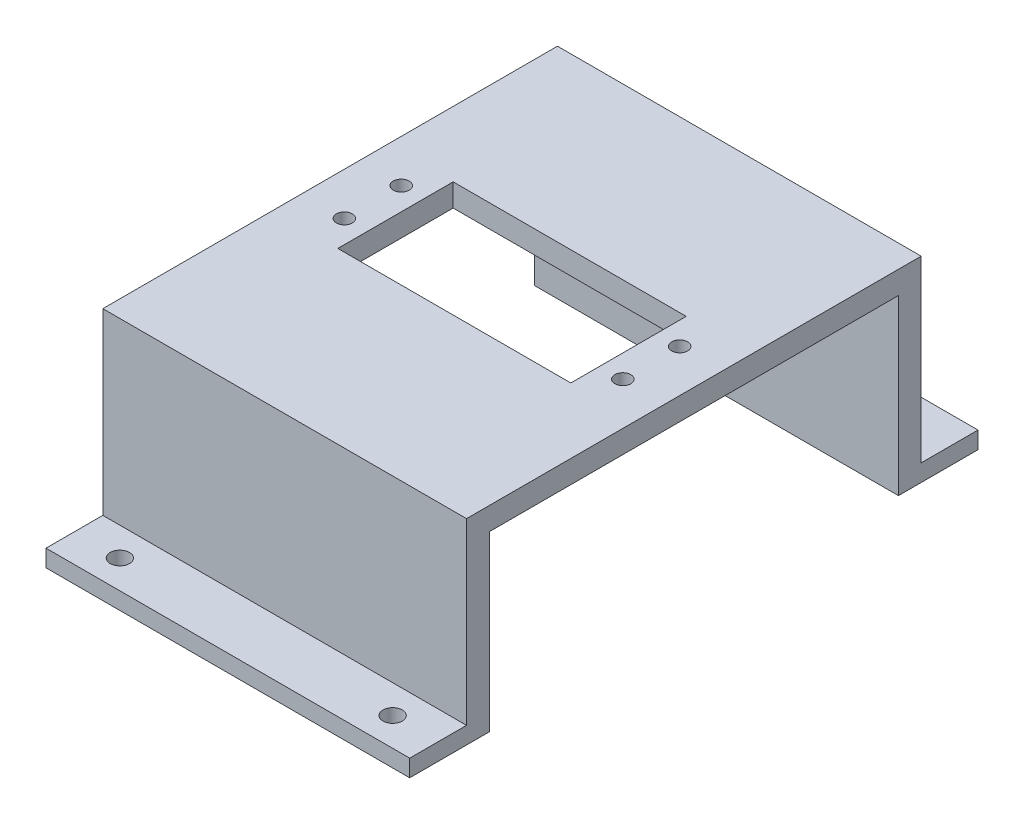
ISO-10303-21;
HEADER;
FILE_DESCRIPTION(('STEP AP214'),'2;1');
FILE_NAME('part.step','',(''),(''),'','','');
FILE_SCHEMA(('AUTOMOTIVE_DESIGN { 1 0 10303 214 1 1 1 1 }'));
ENDSEC;
DATA;
#1=APPLICATION_CONTEXT('core data for automotive mechanical design processes');
#2=APPLICATION_PROTOCOL_DEFINITION('international standard','automotive_design',2000,#1);
#3=PRODUCT_CONTEXT('',#1,'mechanical');
#4=PRODUCT('Part','Part','',(#3));
#5=PRODUCT_RELATED_PRODUCT_CATEGORY('part','',(#4));
#6=PRODUCT_DEFINITION_FORMATION('','',#4);
#7=PRODUCT_DEFINITION_CONTEXT('part definition',#1,'design');
#8=PRODUCT_DEFINITION('design','',#6,#7);
#9=PRODUCT_DEFINITION_SHAPE('','',#8);
#10=(LENGTH_UNIT() NAMED_UNIT(*) SI_UNIT(.MILLI.,.METRE.));
#11=(NAMED_UNIT(*) PLANE_ANGLE_UNIT() SI_UNIT($,.RADIAN.));
#12=(NAMED_UNIT(*) SI_UNIT($,.STERADIAN.) SOLID_ANGLE_UNIT());
#13=UNCERTAINTY_MEASURE_WITH_UNIT(LENGTH_MEASURE(1.E-05),#10,'distance_accuracy_value','');
#14=(GEOMETRIC_REPRESENTATION_CONTEXT(3) GLOBAL_UNCERTAINTY_ASSIGNED_CONTEXT((#13)) GLOBAL_UNIT_ASSIGNED_CONTEXT((#10,
#11,#12)) REPRESENTATION_CONTEXT('',''));
#15=CARTESIAN_POINT('',(0.,0.,0.));
#16=DIRECTION('',(0.,0.,1.));
#17=DIRECTION('',(1.,0.,0.));
#18=AXIS2_PLACEMENT_3D('',#15,#16,#17);
#19=CARTESIAN_POINT('',(88.8,5.,-130.));
#20=DIRECTION('',(0.,-1.,0.));
#21=DIRECTION('',(1.,0.,0.));
#22=AXIS2_PLACEMENT_3D('',#19,#20,#21);
#23=CYLINDRICAL_SURFACE('',#22,1.7);
#24=DIRECTION('',(0.,1.,0.));
#25=VECTOR('',#24,1.);
#26=CARTESIAN_POINT('',(90.5,5.,-130.));
#27=LINE('',#26,#25);
#28=CARTESIAN_POINT('',(90.5,5.,-130.));
#29=VERTEX_POINT('',#28);
#30=CARTESIAN_POINT('',(90.5,8.,-130.));
#31=VERTEX_POINT('',#30);
#32=EDGE_CURVE('E11',#29,#31,#27,.T.);
#33=ORIENTED_EDGE('',*,*,#32,.T.);
#34=CARTESIAN_POINT('',(88.8,8.,-130.));
#35=DIRECTION('',(0.,1.,0.));
#36=DIRECTION('',(1.,0.,0.));
#37=AXIS2_PLACEMENT_3D('',#34,#35,#36);
#38=CIRCLE('',#37,1.7);
#39=EDGE_CURVE('E277',#31,#31,#38,.T.);
#40=ORIENTED_EDGE('',*,*,#39,.T.);
#41=ORIENTED_EDGE('',*,*,#32,.F.);
#42=CARTESIAN_POINT('',(88.8,5.,-130.));
#43=DIRECTION('',(0.,1.,0.));
#44=DIRECTION('',(1.,0.,0.));
#45=AXIS2_PLACEMENT_3D('',#42,#43,#44);
#46=CIRCLE('',#45,1.7);
#47=EDGE_CURVE('E463',#29,#29,#46,.T.);
#48=ORIENTED_EDGE('',*,*,#47,.F.);
#49=EDGE_LOOP('',(#33,#40,#41,#48));
#50=FACE_BOUND('',#49,.T.);
#51=ADVANCED_FACE('F17',(#50),#23,.F.);
#52=CARTESIAN_POINT('',(40.8,5.,-130.));
#53=DIRECTION('',(0.,-1.,0.));
#54=DIRECTION('',(1.,0.,0.));
#55=AXIS2_PLACEMENT_3D('',#52,#53,#54);
#56=CYLINDRICAL_SURFACE('',#55,1.7);
#57=DIRECTION('',(0.,1.,0.));
#58=VECTOR('',#57,1.);
#59=CARTESIAN_POINT('',(42.5,5.,-130.));
#60=LINE('',#59,#58);
#61=CARTESIAN_POINT('',(42.5,5.,-130.));
#62=VERTEX_POINT('',#61);
#63=CARTESIAN_POINT('',(42.5,8.,-130.));
#64=VERTEX_POINT('',#63);
#65=EDGE_CURVE('E25',#62,#64,#60,.T.);
#66=ORIENTED_EDGE('',*,*,#65,.T.);
#67=CARTESIAN_POINT('',(40.8,8.,-130.));
#68=DIRECTION('',(0.,1.,0.));
#69=DIRECTION('',(1.,0.,0.));
#70=AXIS2_PLACEMENT_3D('',#67,#68,#69);
#71=CIRCLE('',#70,1.7);
#72=EDGE_CURVE('E388',#64,#64,#71,.T.);
#73=ORIENTED_EDGE('',*,*,#72,.T.);
#74=ORIENTED_EDGE('',*,*,#65,.F.);
#75=CARTESIAN_POINT('',(40.8,5.,-130.));
#76=DIRECTION('',(0.,1.,0.));
#77=DIRECTION('',(1.,0.,0.));
#78=AXIS2_PLACEMENT_3D('',#75,#76,#77);
#79=CIRCLE('',#78,1.7);
#80=EDGE_CURVE('E459',#62,#62,#79,.T.);
#81=ORIENTED_EDGE('',*,*,#80,.F.);
#82=EDGE_LOOP('',(#66,#73,#74,#81));
#83=FACE_BOUND('',#82,.T.);
#84=ADVANCED_FACE('F952',(#83),#56,.F.);
#85=CARTESIAN_POINT('',(89.3,35.5,-90.));
#86=DIRECTION('',(0.,-1.,0.));
#87=DIRECTION('',(1.,0.,0.));
#88=AXIS2_PLACEMENT_3D('',#85,#86,#87);
#89=CYLINDRICAL_SURFACE('',#88,1.4);
#90=DIRECTION('',(0.,1.,0.));
#91=VECTOR('',#90,1.);
#92=CARTESIAN_POINT('',(90.7,35.5,-90.));
#93=LINE('',#92,#91);
#94=CARTESIAN_POINT('',(90.7,35.5,-90.));
#95=VERTEX_POINT('',#94);
#96=CARTESIAN_POINT('',(90.7,39.5,-90.));
#97=VERTEX_POINT('',#96);
#98=EDGE_CURVE('E381',#95,#97,#93,.T.);
#99=ORIENTED_EDGE('',*,*,#98,.T.);
#100=CARTESIAN_POINT('',(89.3,39.5,-90.));
#101=DIRECTION('',(0.,1.,0.));
#102=DIRECTION('',(1.,0.,0.));
#103=AXIS2_PLACEMENT_3D('',#100,#101,#102);
#104=CIRCLE('',#103,1.4);
#105=EDGE_CURVE('E400',#97,#97,#104,.T.);
#106=ORIENTED_EDGE('',*,*,#105,.T.);
#107=ORIENTED_EDGE('',*,*,#98,.F.);
#108=CARTESIAN_POINT('',(89.3,35.5,-90.));
#109=DIRECTION('',(0.,1.,0.));
#110=DIRECTION('',(1.,0.,0.));
#111=AXIS2_PLACEMENT_3D('',#108,#109,#110);
#112=CIRCLE('',#111,1.4);
#113=EDGE_CURVE('E455',#95,#95,#112,.T.);
#114=ORIENTED_EDGE('',*,*,#113,.F.);
#115=EDGE_LOOP('',(#99,#106,#107,#114));
#116=FACE_BOUND('',#115,.T.);
#117=ADVANCED_FACE('F493',(#116),#89,.F.);
#118=CARTESIAN_POINT('',(85.3,35.5,-95.15));
#119=DIRECTION('',(0.,0.,1.));
#120=DIRECTION('',(0.,-1.,0.));
#121=AXIS2_PLACEMENT_3D('',#118,#119,#120);
#122=PLANE('',#121);
#123=DIRECTION('',(0.,1.,0.));
#124=VECTOR('',#123,1.);
#125=CARTESIAN_POINT('',(85.3,35.5,-95.15));
#126=LINE('',#125,#124);
#127=CARTESIAN_POINT('',(85.3,35.5,-95.15));
#128=VERTEX_POINT('',#127);
#129=CARTESIAN_POINT('',(85.3,39.5,-95.15));
#130=VERTEX_POINT('',#129);
#131=EDGE_CURVE('E309',#128,#130,#126,.T.);
#132=ORIENTED_EDGE('',*,*,#131,.T.);
#133=DIRECTION('',(-1.,0.,0.));
#134=VECTOR('',#133,1.);
#135=CARTESIAN_POINT('',(85.3,39.5,-95.15));
#136=LINE('',#135,#134);
#137=CARTESIAN_POINT('',(44.3,39.5,-95.15));
#138=VERTEX_POINT('',#137);
#139=EDGE_CURVE('E384',#130,#138,#136,.T.);
#140=ORIENTED_EDGE('',*,*,#139,.T.);
#141=DIRECTION('',(0.,1.,0.));
#142=VECTOR('',#141,1.);
#143=CARTESIAN_POINT('',(44.3,35.5,-95.15));
#144=LINE('',#143,#142);
#145=CARTESIAN_POINT('',(44.3,35.5,-95.15));
#146=VERTEX_POINT('',#145);
#147=EDGE_CURVE('E307',#146,#138,#144,.T.);
#148=ORIENTED_EDGE('',*,*,#147,.F.);
#149=DIRECTION('',(-1.,0.,0.));
#150=VECTOR('',#149,1.);
#151=CARTESIAN_POINT('',(85.3,35.5,-95.15));
#152=LINE('',#151,#150);
#153=EDGE_CURVE('E439',#128,#146,#152,.T.);
#154=ORIENTED_EDGE('',*,*,#153,.F.);
#155=EDGE_LOOP('',(#132,#140,#148,#154));
#156=FACE_BOUND('',#155,.T.);
#157=ADVANCED_FACE('F940',(#156),#122,.T.);
#158=CARTESIAN_POINT('',(85.3,35.5,-74.85));
#159=DIRECTION('',(-1.,0.,0.));
#160=DIRECTION('',(0.,0.,1.));
#161=AXIS2_PLACEMENT_3D('',#158,#159,#160);
#162=PLANE('',#161);
#163=DIRECTION('',(0.,1.,0.));
#164=VECTOR('',#163,1.);
#165=CARTESIAN_POINT('',(85.3,35.5,-74.85));
#166=LINE('',#165,#164);
#167=CARTESIAN_POINT('',(85.3,35.5,-74.85));
#168=VERTEX_POINT('',#167);
#169=CARTESIAN_POINT('',(85.3,39.5,-74.85));
#170=VERTEX_POINT('',#169);
#171=EDGE_CURVE('E313',#168,#170,#166,.T.);
#172=ORIENTED_EDGE('',*,*,#171,.T.);
#173=DIRECTION('',(0.,0.,-1.));
#174=VECTOR('',#173,1.);
#175=CARTESIAN_POINT('',(85.3,39.5,-74.85));
#176=LINE('',#175,#174);
#177=EDGE_CURVE('E386',#170,#130,#176,.T.);
#178=ORIENTED_EDGE('',*,*,#177,.T.);
#179=ORIENTED_EDGE('',*,*,#131,.F.);
#180=DIRECTION('',(0.,0.,-1.));
#181=VECTOR('',#180,1.);
#182=CARTESIAN_POINT('',(85.3,35.5,-74.85));
#183=LINE('',#182,#181);
#184=EDGE_CURVE('E436',#168,#128,#183,.T.);
#185=ORIENTED_EDGE('',*,*,#184,.F.);
#186=EDGE_LOOP('',(#172,#178,#179,#185));
#187=FACE_BOUND('',#186,.T.);
#188=ADVANCED_FACE('F928',(#187),#162,.T.);
#189=CARTESIAN_POINT('',(44.3,35.5,-95.15));
#190=DIRECTION('',(1.,0.,0.));
#191=DIRECTION('',(0.,1.,0.));
#192=AXIS2_PLACEMENT_3D('',#189,#190,#191);
#193=PLANE('',#192);
#194=ORIENTED_EDGE('',*,*,#147,.T.);
#195=DIRECTION('',(0.,0.,1.));
#196=VECTOR('',#195,1.);
#197=CARTESIAN_POINT('',(44.3,39.5,-95.15));
#198=LINE('',#197,#196);
#199=CARTESIAN_POINT('',(44.3,39.5,-74.85));
#200=VERTEX_POINT('',#199);
#201=EDGE_CURVE('E378',#138,#200,#198,.T.);
#202=ORIENTED_EDGE('',*,*,#201,.T.);
#203=DIRECTION('',(0.,1.,0.));
#204=VECTOR('',#203,1.);
#205=CARTESIAN_POINT('',(44.3,35.5,-74.85));
#206=LINE('',#205,#204);
#207=CARTESIAN_POINT('',(44.3,35.5,-74.85));
#208=VERTEX_POINT('',#207);
#209=EDGE_CURVE('E483',#208,#200,#206,.T.);
#210=ORIENTED_EDGE('',*,*,#209,.F.);
#211=DIRECTION('',(0.,0.,1.));
#212=VECTOR('',#211,1.);
#213=CARTESIAN_POINT('',(44.3,35.5,-95.15));
#214=LINE('',#213,#212);
#215=EDGE_CURVE('E441',#146,#208,#214,.T.);
#216=ORIENTED_EDGE('',*,*,#215,.F.);
#217=EDGE_LOOP('',(#194,#202,#210,#216));
#218=FACE_BOUND('',#217,.T.);
#219=ADVANCED_FACE('F919',(#218),#193,.T.);
#220=CARTESIAN_POINT('',(44.3,35.5,-74.85));
#221=DIRECTION('',(0.,0.,-1.));
#222=DIRECTION('',(-1.,0.,0.));
#223=AXIS2_PLACEMENT_3D('',#220,#221,#222);
#224=PLANE('',#223);
#225=ORIENTED_EDGE('',*,*,#209,.T.);
#226=DIRECTION('',(1.,0.,0.));
#227=VECTOR('',#226,1.);
#228=CARTESIAN_POINT('',(44.3,39.5,-74.85));
#229=LINE('',#228,#227);
#230=EDGE_CURVE('E372',#200,#170,#229,.T.);
#231=ORIENTED_EDGE('',*,*,#230,.T.);
#232=ORIENTED_EDGE('',*,*,#171,.F.);
#233=DIRECTION('',(1.,0.,0.));
#234=VECTOR('',#233,1.);
#235=CARTESIAN_POINT('',(44.3,35.5,-74.85));
#236=LINE('',#235,#234);
#237=EDGE_CURVE('E449',#208,#168,#236,.T.);
#238=ORIENTED_EDGE('',*,*,#237,.F.);
#239=EDGE_LOOP('',(#225,#231,#232,#238));
#240=FACE_BOUND('',#239,.T.);
#241=ADVANCED_FACE('F909',(#240),#224,.T.);
#242=CARTESIAN_POINT('',(40.3,35.5,-90.));
#243=DIRECTION('',(0.,-1.,0.));
#244=DIRECTION('',(1.,0.,0.));
#245=AXIS2_PLACEMENT_3D('',#242,#243,#244);
#246=CYLINDRICAL_SURFACE('',#245,1.4);
#247=DIRECTION('',(0.,1.,0.));
#248=VECTOR('',#247,1.);
#249=CARTESIAN_POINT('',(41.7,35.5,-90.));
#250=LINE('',#249,#248);
#251=CARTESIAN_POINT('',(41.7,35.5,-90.));
#252=VERTEX_POINT('',#251);
#253=CARTESIAN_POINT('',(41.7,39.5,-90.));
#254=VERTEX_POINT('',#253);
#255=EDGE_CURVE('E477',#252,#254,#250,.T.);
#256=ORIENTED_EDGE('',*,*,#255,.T.);
#257=CARTESIAN_POINT('',(40.3,39.5,-90.));
#258=DIRECTION('',(0.,1.,0.));
#259=DIRECTION('',(1.,0.,0.));
#260=AXIS2_PLACEMENT_3D('',#257,#258,#259);
#261=CIRCLE('',#260,1.4);
#262=EDGE_CURVE('E367',#254,#254,#261,.T.);
#263=ORIENTED_EDGE('',*,*,#262,.T.);
#264=ORIENTED_EDGE('',*,*,#255,.F.);
#265=CARTESIAN_POINT('',(40.3,35.5,-90.));
#266=DIRECTION('',(0.,1.,0.));
#267=DIRECTION('',(1.,0.,0.));
#268=AXIS2_PLACEMENT_3D('',#265,#266,#267);
#269=CIRCLE('',#268,1.4);
#270=EDGE_CURVE('E435',#252,#252,#269,.T.);
#271=ORIENTED_EDGE('',*,*,#270,.F.);
#272=EDGE_LOOP('',(#256,#263,#264,#271));
#273=FACE_BOUND('',#272,.T.);
#274=ADVANCED_FACE('F901',(#273),#246,.F.);
#275=CARTESIAN_POINT('',(89.3,35.5,-80.));
#276=DIRECTION('',(0.,-1.,0.));
#277=DIRECTION('',(1.,0.,0.));
#278=AXIS2_PLACEMENT_3D('',#275,#276,#277);
#279=CYLINDRICAL_SURFACE('',#278,1.4);
#280=DIRECTION('',(0.,1.,0.));
#281=VECTOR('',#280,1.);
#282=CARTESIAN_POINT('',(90.7,35.5,-80.));
#283=LINE('',#282,#281);
#284=CARTESIAN_POINT('',(90.7,35.5,-80.));
#285=VERTEX_POINT('',#284);
#286=CARTESIAN_POINT('',(90.7,39.5,-80.));
#287=VERTEX_POINT('',#286);
#288=EDGE_CURVE('E480',#285,#287,#283,.T.);
#289=ORIENTED_EDGE('',*,*,#288,.T.);
#290=CARTESIAN_POINT('',(89.3,39.5,-80.));
#291=DIRECTION('',(0.,1.,0.));
#292=DIRECTION('',(1.,0.,0.));
#293=AXIS2_PLACEMENT_3D('',#290,#291,#292);
#294=CIRCLE('',#293,1.4);
#295=EDGE_CURVE('E368',#287,#287,#294,.T.);
#296=ORIENTED_EDGE('',*,*,#295,.T.);
#297=ORIENTED_EDGE('',*,*,#288,.F.);
#298=CARTESIAN_POINT('',(89.3,35.5,-80.));
#299=DIRECTION('',(0.,1.,0.));
#300=DIRECTION('',(1.,0.,0.));
#301=AXIS2_PLACEMENT_3D('',#298,#299,#300);
#302=CIRCLE('',#301,1.4);
#303=EDGE_CURVE('E428',#285,#285,#302,.T.);
#304=ORIENTED_EDGE('',*,*,#303,.F.);
#305=EDGE_LOOP('',(#289,#296,#297,#304));
#306=FACE_BOUND('',#305,.T.);
#307=ADVANCED_FACE('F895',(#306),#279,.F.);
#308=CARTESIAN_POINT('',(40.3,35.5,-80.));
#309=DIRECTION('',(0.,-1.,0.));
#310=DIRECTION('',(1.,0.,0.));
#311=AXIS2_PLACEMENT_3D('',#308,#309,#310);
#312=CYLINDRICAL_SURFACE('',#311,1.4);
#313=DIRECTION('',(0.,1.,0.));
#314=VECTOR('',#313,1.);
#315=CARTESIAN_POINT('',(41.7,35.5,-80.));
#316=LINE('',#315,#314);
#317=CARTESIAN_POINT('',(41.7,35.5,-80.));
#318=VERTEX_POINT('',#317);
#319=CARTESIAN_POINT('',(41.7,39.5,-80.));
#320=VERTEX_POINT('',#319);
#321=EDGE_CURVE('E475',#318,#320,#316,.T.);
#322=ORIENTED_EDGE('',*,*,#321,.T.);
#323=CARTESIAN_POINT('',(40.3,39.5,-80.));
#324=DIRECTION('',(0.,1.,0.));
#325=DIRECTION('',(1.,0.,0.));
#326=AXIS2_PLACEMENT_3D('',#323,#324,#325);
#327=CIRCLE('',#326,1.4);
#328=EDGE_CURVE('E362',#320,#320,#327,.T.);
#329=ORIENTED_EDGE('',*,*,#328,.T.);
#330=ORIENTED_EDGE('',*,*,#321,.F.);
#331=CARTESIAN_POINT('',(40.3,35.5,-80.));
#332=DIRECTION('',(0.,1.,0.));
#333=DIRECTION('',(1.,0.,0.));
#334=AXIS2_PLACEMENT_3D('',#331,#332,#333);
#335=CIRCLE('',#334,1.4);
#336=EDGE_CURVE('E424',#318,#318,#335,.T.);
#337=ORIENTED_EDGE('',*,*,#336,.F.);
#338=EDGE_LOOP('',(#322,#329,#330,#337));
#339=FACE_BOUND('',#338,.T.);
#340=ADVANCED_FACE('F884',(#339),#312,.F.);
#341=CARTESIAN_POINT('',(88.8,5.,-40.));
#342=DIRECTION('',(0.,-1.,0.));
#343=DIRECTION('',(1.,0.,0.));
#344=AXIS2_PLACEMENT_3D('',#341,#342,#343);
#345=CYLINDRICAL_SURFACE('',#344,1.7);
#346=DIRECTION('',(0.,1.,0.));
#347=VECTOR('',#346,1.);
#348=CARTESIAN_POINT('',(90.5,5.,-40.));
#349=LINE('',#348,#347);
#350=CARTESIAN_POINT('',(90.5,5.,-40.));
#351=VERTEX_POINT('',#350);
#352=CARTESIAN_POINT('',(90.5,8.,-40.));
#353=VERTEX_POINT('',#352);
#354=EDGE_CURVE('E274',#351,#353,#349,.T.);
#355=ORIENTED_EDGE('',*,*,#354,.T.);
#356=CARTESIAN_POINT('',(88.8,8.,-40.));
#357=DIRECTION('',(0.,1.,0.));
#358=DIRECTION('',(1.,0.,0.));
#359=AXIS2_PLACEMENT_3D('',#356,#357,#358);
#360=CIRCLE('',#359,1.7);
#361=EDGE_CURVE('E318',#353,#353,#360,.T.);
#362=ORIENTED_EDGE('',*,*,#361,.T.);
#363=ORIENTED_EDGE('',*,*,#354,.F.);
#364=CARTESIAN_POINT('',(88.8,5.,-40.));
#365=DIRECTION('',(0.,1.,0.));
#366=DIRECTION('',(1.,0.,0.));
#367=AXIS2_PLACEMENT_3D('',#364,#365,#366);
#368=CIRCLE('',#367,1.7);
#369=EDGE_CURVE('E412',#351,#351,#368,.T.);
#370=ORIENTED_EDGE('',*,*,#369,.F.);
#371=EDGE_LOOP('',(#355,#362,#363,#370));
#372=FACE_BOUND('',#371,.T.);
#373=ADVANCED_FACE('F872',(#372),#345,.F.);
#374=CARTESIAN_POINT('',(40.8,5.,-40.));
#375=DIRECTION('',(0.,-1.,0.));
#376=DIRECTION('',(1.,0.,0.));
#377=AXIS2_PLACEMENT_3D('',#374,#375,#376);
#378=CYLINDRICAL_SURFACE('',#377,1.7);
#379=DIRECTION('',(0.,1.,0.));
#380=VECTOR('',#379,1.);
#381=CARTESIAN_POINT('',(42.5,5.,-40.));
#382=LINE('',#381,#380);
#383=CARTESIAN_POINT('',(42.5,5.,-40.));
#384=VERTEX_POINT('',#383);
#385=CARTESIAN_POINT('',(42.5,8.,-40.));
#386=VERTEX_POINT('',#385);
#387=EDGE_CURVE('E275',#384,#386,#382,.T.);
#388=ORIENTED_EDGE('',*,*,#387,.T.);
#389=CARTESIAN_POINT('',(40.8,8.,-40.));
#390=DIRECTION('',(0.,1.,0.));
#391=DIRECTION('',(1.,0.,0.));
#392=AXIS2_PLACEMENT_3D('',#389,#390,#391);
#393=CIRCLE('',#392,1.7);
#394=EDGE_CURVE('E314',#386,#386,#393,.T.);
#395=ORIENTED_EDGE('',*,*,#394,.T.);
#396=ORIENTED_EDGE('',*,*,#387,.F.);
#397=CARTESIAN_POINT('',(40.8,5.,-40.));
#398=DIRECTION('',(0.,1.,0.));
#399=DIRECTION('',(1.,0.,0.));
#400=AXIS2_PLACEMENT_3D('',#397,#398,#399);
#401=CIRCLE('',#400,1.7);
#402=EDGE_CURVE('E409',#384,#384,#401,.T.);
#403=ORIENTED_EDGE('',*,*,#402,.F.);
#404=EDGE_LOOP('',(#388,#395,#396,#403));
#405=FACE_BOUND('',#404,.T.);
#406=ADVANCED_FACE('F862',(#405),#378,.F.);
#407=CARTESIAN_POINT('',(64.8,8.,-130.));
#408=DIRECTION('',(0.,1.,0.));
#409=DIRECTION('',(0.,0.,-1.));
#410=AXIS2_PLACEMENT_3D('',#407,#408,#409);
#411=PLANE('',#410);
#412=ORIENTED_EDGE('',*,*,#39,.F.);
#413=EDGE_LOOP('',(#412));
#414=FACE_BOUND('',#413,.T.);
#415=ORIENTED_EDGE('',*,*,#72,.F.);
#416=EDGE_LOOP('',(#415));
#417=FACE_BOUND('',#416,.T.);
#418=DIRECTION('',(1.,0.,0.));
#419=VECTOR('',#418,1.);
#420=CARTESIAN_POINT('',(32.8,8.,-125.));
#421=LINE('',#420,#419);
#422=CARTESIAN_POINT('',(32.8,8.,-125.));
#423=VERTEX_POINT('',#422);
#424=CARTESIAN_POINT('',(96.8,8.,-125.));
#425=VERTEX_POINT('',#424);
#426=EDGE_CURVE('E405',#423,#425,#421,.T.);
#427=ORIENTED_EDGE('',*,*,#426,.T.);
#428=DIRECTION('',(0.,0.,-1.));
#429=VECTOR('',#428,1.);
#430=CARTESIAN_POINT('',(96.8,8.,-125.));
#431=LINE('',#430,#429);
#432=CARTESIAN_POINT('',(96.8,8.,-135.));
#433=VERTEX_POINT('',#432);
#434=EDGE_CURVE('E347',#425,#433,#431,.T.);
#435=ORIENTED_EDGE('',*,*,#434,.T.);
#436=DIRECTION('',(-1.,0.,0.));
#437=VECTOR('',#436,1.);
#438=CARTESIAN_POINT('',(96.8,8.,-135.));
#439=LINE('',#438,#437);
#440=CARTESIAN_POINT('',(32.8,8.,-135.));
#441=VERTEX_POINT('',#440);
#442=EDGE_CURVE('E394',#433,#441,#439,.T.);
#443=ORIENTED_EDGE('',*,*,#442,.T.);
#444=DIRECTION('',(0.,0.,1.));
#445=VECTOR('',#444,1.);
#446=CARTESIAN_POINT('',(32.8,8.,-135.));
#447=LINE('',#446,#445);
#448=EDGE_CURVE('E255',#441,#423,#447,.T.);
#449=ORIENTED_EDGE('',*,*,#448,.T.);
#450=EDGE_LOOP('',(#427,#435,#443,#449));
#451=FACE_BOUND('',#450,.T.);
#452=ADVANCED_FACE('F538',(#414,#417,#451),#411,.T.);
#453=CARTESIAN_POINT('',(96.8,5.,-135.));
#454=DIRECTION('',(0.,0.,1.));
#455=DIRECTION('',(0.,-1.,0.));
#456=AXIS2_PLACEMENT_3D('',#453,#454,#455);
#457=PLANE('',#456);
#458=DIRECTION('',(-1.,0.,0.));
#459=VECTOR('',#458,1.);
#460=CARTESIAN_POINT('',(96.8,5.,-135.));
#461=LINE('',#460,#459);
#462=CARTESIAN_POINT('',(96.8,5.,-135.));
#463=VERTEX_POINT('',#462);
#464=CARTESIAN_POINT('',(32.8,5.,-135.));
#465=VERTEX_POINT('',#464);
#466=EDGE_CURVE('E457',#463,#465,#461,.T.);
#467=ORIENTED_EDGE('',*,*,#466,.T.);
#468=DIRECTION('',(0.,1.,0.));
#469=VECTOR('',#468,1.);
#470=CARTESIAN_POINT('',(32.8,5.,-135.));
#471=LINE('',#470,#469);
#472=EDGE_CURVE('E280',#465,#441,#471,.T.);
#473=ORIENTED_EDGE('',*,*,#472,.T.);
#474=ORIENTED_EDGE('',*,*,#442,.F.);
#475=DIRECTION('',(0.,1.,0.));
#476=VECTOR('',#475,1.);
#477=CARTESIAN_POINT('',(96.8,5.,-135.));
#478=LINE('',#477,#476);
#479=EDGE_CURVE('E343',#463,#433,#478,.T.);
#480=ORIENTED_EDGE('',*,*,#479,.F.);
#481=EDGE_LOOP('',(#467,#473,#474,#480));
#482=FACE_BOUND('',#481,.T.);
#483=ADVANCED_FACE('F532',(#482),#457,.F.);
#484=CARTESIAN_POINT('',(64.8,5.,-123.));
#485=DIRECTION('',(0.,1.,0.));
#486=DIRECTION('',(0.,0.,-1.));
#487=AXIS2_PLACEMENT_3D('',#484,#485,#486);
#488=PLANE('',#487);
#489=ORIENTED_EDGE('',*,*,#47,.T.);
#490=EDGE_LOOP('',(#489));
#491=FACE_BOUND('',#490,.T.);
#492=ORIENTED_EDGE('',*,*,#80,.T.);
#493=EDGE_LOOP('',(#492));
#494=FACE_BOUND('',#493,.T.);
#495=DIRECTION('',(0.,0.,1.));
#496=VECTOR('',#495,1.);
#497=CARTESIAN_POINT('',(32.8,5.,-135.));
#498=LINE('',#497,#496);
#499=CARTESIAN_POINT('',(32.8,5.,-121.));
#500=VERTEX_POINT('',#499);
#501=EDGE_CURVE('E281',#465,#500,#498,.T.);
#502=ORIENTED_EDGE('',*,*,#501,.F.);
#503=ORIENTED_EDGE('',*,*,#466,.F.);
#504=DIRECTION('',(0.,0.,-1.));
#505=VECTOR('',#504,1.);
#506=CARTESIAN_POINT('',(96.8,5.,-121.));
#507=LINE('',#506,#505);
#508=CARTESIAN_POINT('',(96.8,5.,-121.));
#509=VERTEX_POINT('',#508);
#510=EDGE_CURVE('E342',#509,#463,#507,.T.);
#511=ORIENTED_EDGE('',*,*,#510,.F.);
#512=DIRECTION('',(1.,0.,0.));
#513=VECTOR('',#512,1.);
#514=CARTESIAN_POINT('',(32.8,5.,-121.));
#515=LINE('',#514,#513);
#516=EDGE_CURVE('E460',#500,#509,#515,.T.);
#517=ORIENTED_EDGE('',*,*,#516,.F.);
#518=EDGE_LOOP('',(#502,#503,#511,#517));
#519=FACE_BOUND('',#518,.T.);
#520=ADVANCED_FACE('F533',(#491,#494,#519),#488,.F.);
#521=CARTESIAN_POINT('',(32.8,5.,-121.));
#522=DIRECTION('',(0.,0.,-1.));
#523=DIRECTION('',(-1.,0.,0.));
#524=AXIS2_PLACEMENT_3D('',#521,#522,#523);
#525=PLANE('',#524);
#526=ORIENTED_EDGE('',*,*,#516,.T.);
#527=DIRECTION('',(0.,1.,0.));
#528=VECTOR('',#527,1.);
#529=CARTESIAN_POINT('',(96.8,5.,-121.));
#530=LINE('',#529,#528);
#531=CARTESIAN_POINT('',(96.8,35.5,-121.));
#532=VERTEX_POINT('',#531);
#533=EDGE_CURVE('E337',#509,#532,#530,.T.);
#534=ORIENTED_EDGE('',*,*,#533,.T.);
#535=DIRECTION('',(1.,0.,0.));
#536=VECTOR('',#535,1.);
#537=CARTESIAN_POINT('',(32.8,35.5,-121.));
#538=LINE('',#537,#536);
#539=CARTESIAN_POINT('',(32.8,35.5,-121.));
#540=VERTEX_POINT('',#539);
#541=EDGE_CURVE('E423',#540,#532,#538,.T.);
#542=ORIENTED_EDGE('',*,*,#541,.F.);
#543=DIRECTION('',(0.,1.,0.));
#544=VECTOR('',#543,1.);
#545=CARTESIAN_POINT('',(32.8,5.,-121.));
#546=LINE('',#545,#544);
#547=EDGE_CURVE('E295',#500,#540,#546,.T.);
#548=ORIENTED_EDGE('',*,*,#547,.F.);
#549=EDGE_LOOP('',(#526,#534,#542,#548));
#550=FACE_BOUND('',#549,.T.);
#551=ADVANCED_FACE('F501',(#550),#525,.F.);
#552=CARTESIAN_POINT('',(64.8,35.5,-85.));
#553=DIRECTION('',(0.,1.,0.));
#554=DIRECTION('',(0.,0.,-1.));
#555=AXIS2_PLACEMENT_3D('',#552,#553,#554);
#556=PLANE('',#555);
#557=ORIENTED_EDGE('',*,*,#113,.T.);
#558=EDGE_LOOP('',(#557));
#559=FACE_BOUND('',#558,.T.);
#560=ORIENTED_EDGE('',*,*,#184,.T.);
#561=ORIENTED_EDGE('',*,*,#153,.T.);
#562=ORIENTED_EDGE('',*,*,#215,.T.);
#563=ORIENTED_EDGE('',*,*,#237,.T.);
#564=EDGE_LOOP('',(#560,#561,#562,#563));
#565=FACE_BOUND('',#564,.T.);
#566=ORIENTED_EDGE('',*,*,#270,.T.);
#567=EDGE_LOOP('',(#566));
#568=FACE_BOUND('',#567,.T.);
#569=ORIENTED_EDGE('',*,*,#303,.T.);
#570=EDGE_LOOP('',(#569));
#571=FACE_BOUND('',#570,.T.);
#572=ORIENTED_EDGE('',*,*,#336,.T.);
#573=EDGE_LOOP('',(#572));
#574=FACE_BOUND('',#573,.T.);
#575=DIRECTION('',(0.,0.,-1.));
#576=VECTOR('',#575,1.);
#577=CARTESIAN_POINT('',(96.8,35.5,-45.));
#578=LINE('',#577,#576);
#579=CARTESIAN_POINT('',(96.8,35.5,-49.));
#580=VERTEX_POINT('',#579);
#581=EDGE_CURVE('E334',#580,#532,#578,.T.);
#582=ORIENTED_EDGE('',*,*,#581,.F.);
#583=DIRECTION('',(-1.,0.,0.));
#584=VECTOR('',#583,1.);
#585=CARTESIAN_POINT('',(96.8,35.5,-49.));
#586=LINE('',#585,#584);
#587=CARTESIAN_POINT('',(32.8,35.5,-49.));
#588=VERTEX_POINT('',#587);
#589=EDGE_CURVE('E416',#580,#588,#586,.T.);
#590=ORIENTED_EDGE('',*,*,#589,.T.);
#591=DIRECTION('',(0.,0.,1.));
#592=VECTOR('',#591,1.);
#593=CARTESIAN_POINT('',(32.8,35.5,-125.));
#594=LINE('',#593,#592);
#595=EDGE_CURVE('E290',#540,#588,#594,.T.);
#596=ORIENTED_EDGE('',*,*,#595,.F.);
#597=ORIENTED_EDGE('',*,*,#541,.T.);
#598=EDGE_LOOP('',(#582,#590,#596,#597));
#599=FACE_BOUND('',#598,.T.);
#600=ADVANCED_FACE('F500',(#559,#565,#568,#571,#574,#599),#556,.F.);
#601=CARTESIAN_POINT('',(96.8,5.,-49.));
#602=DIRECTION('',(0.,0.,1.));
#603=DIRECTION('',(0.,-1.,0.));
#604=AXIS2_PLACEMENT_3D('',#601,#602,#603);
#605=PLANE('',#604);
#606=DIRECTION('',(-1.,0.,0.));
#607=VECTOR('',#606,1.);
#608=CARTESIAN_POINT('',(96.8,5.,-49.));
#609=LINE('',#608,#607);
#610=CARTESIAN_POINT('',(96.8,5.,-49.));
#611=VERTEX_POINT('',#610);
#612=CARTESIAN_POINT('',(32.8,5.,-49.));
#613=VERTEX_POINT('',#612);
#614=EDGE_CURVE('E410',#611,#613,#609,.T.);
#615=ORIENTED_EDGE('',*,*,#614,.T.);
#616=DIRECTION('',(0.,1.,0.));
#617=VECTOR('',#616,1.);
#618=CARTESIAN_POINT('',(32.8,5.,-49.));
#619=LINE('',#618,#617);
#620=EDGE_CURVE('E282',#613,#588,#619,.T.);
#621=ORIENTED_EDGE('',*,*,#620,.T.);
#622=ORIENTED_EDGE('',*,*,#589,.F.);
#623=DIRECTION('',(0.,1.,0.));
#624=VECTOR('',#623,1.);
#625=CARTESIAN_POINT('',(96.8,5.,-49.));
#626=LINE('',#625,#624);
#627=EDGE_CURVE('E328',#611,#580,#626,.T.);
#628=ORIENTED_EDGE('',*,*,#627,.F.);
#629=EDGE_LOOP('',(#615,#621,#622,#628));
#630=FACE_BOUND('',#629,.T.);
#631=ADVANCED_FACE('F498',(#630),#605,.F.);
#632=CARTESIAN_POINT('',(64.8,5.,-47.));
#633=DIRECTION('',(0.,1.,0.));
#634=DIRECTION('',(0.,0.,-1.));
#635=AXIS2_PLACEMENT_3D('',#632,#633,#634);
#636=PLANE('',#635);
#637=ORIENTED_EDGE('',*,*,#369,.T.);
#638=EDGE_LOOP('',(#637));
#639=FACE_BOUND('',#638,.T.);
#640=ORIENTED_EDGE('',*,*,#402,.T.);
#641=EDGE_LOOP('',(#640));
#642=FACE_BOUND('',#641,.T.);
#643=DIRECTION('',(0.,0.,-1.));
#644=VECTOR('',#643,1.);
#645=CARTESIAN_POINT('',(96.8,5.,-35.));
#646=LINE('',#645,#644);
#647=CARTESIAN_POINT('',(96.8,5.,-35.));
#648=VERTEX_POINT('',#647);
#649=EDGE_CURVE('E324',#648,#611,#646,.T.);
#650=ORIENTED_EDGE('',*,*,#649,.F.);
#651=DIRECTION('',(1.,0.,0.));
#652=VECTOR('',#651,1.);
#653=CARTESIAN_POINT('',(32.8,5.,-35.));
#654=LINE('',#653,#652);
#655=CARTESIAN_POINT('',(32.8,5.,-35.));
#656=VERTEX_POINT('',#655);
#657=EDGE_CURVE('E402',#656,#648,#654,.T.);
#658=ORIENTED_EDGE('',*,*,#657,.F.);
#659=DIRECTION('',(0.,0.,1.));
#660=VECTOR('',#659,1.);
#661=CARTESIAN_POINT('',(32.8,5.,-49.));
#662=LINE('',#661,#660);
#663=EDGE_CURVE('E287',#613,#656,#662,.T.);
#664=ORIENTED_EDGE('',*,*,#663,.F.);
#665=ORIENTED_EDGE('',*,*,#614,.F.);
#666=EDGE_LOOP('',(#650,#658,#664,#665));
#667=FACE_BOUND('',#666,.T.);
#668=ADVANCED_FACE('F555',(#639,#642,#667),#636,.F.);
#669=CARTESIAN_POINT('',(32.8,5.,-35.));
#670=DIRECTION('',(0.,0.,-1.));
#671=DIRECTION('',(-1.,0.,0.));
#672=AXIS2_PLACEMENT_3D('',#669,#670,#671);
#673=PLANE('',#672);
#674=ORIENTED_EDGE('',*,*,#657,.T.);
#675=DIRECTION('',(0.,1.,0.));
#676=VECTOR('',#675,1.);
#677=CARTESIAN_POINT('',(96.8,5.,-35.));
#678=LINE('',#677,#676);
#679=CARTESIAN_POINT('',(96.8,8.,-35.));
#680=VERTEX_POINT('',#679);
#681=EDGE_CURVE('E325',#648,#680,#678,.T.);
#682=ORIENTED_EDGE('',*,*,#681,.T.);
#683=DIRECTION('',(1.,0.,0.));
#684=VECTOR('',#683,1.);
#685=CARTESIAN_POINT('',(32.8,8.,-35.));
#686=LINE('',#685,#684);
#687=CARTESIAN_POINT('',(32.8,8.,-35.));
#688=VERTEX_POINT('',#687);
#689=EDGE_CURVE('E269',#688,#680,#686,.T.);
#690=ORIENTED_EDGE('',*,*,#689,.F.);
#691=DIRECTION('',(0.,1.,0.));
#692=VECTOR('',#691,1.);
#693=CARTESIAN_POINT('',(32.8,5.,-35.));
#694=LINE('',#693,#692);
#695=EDGE_CURVE('E305',#656,#688,#694,.T.);
#696=ORIENTED_EDGE('',*,*,#695,.F.);
#697=EDGE_LOOP('',(#674,#682,#690,#696));
#698=FACE_BOUND('',#697,.T.);
#699=ADVANCED_FACE('F551',(#698),#673,.F.);
#700=CARTESIAN_POINT('',(96.8,35.5,-125.));
#701=DIRECTION('',(0.,0.,1.));
#702=DIRECTION('',(0.,-1.,0.));
#703=AXIS2_PLACEMENT_3D('',#700,#701,#702);
#704=PLANE('',#703);
#705=ORIENTED_EDGE('',*,*,#426,.F.);
#706=DIRECTION('',(0.,-1.,0.));
#707=VECTOR('',#706,1.);
#708=CARTESIAN_POINT('',(32.8,39.5,-125.));
#709=LINE('',#708,#707);
#710=CARTESIAN_POINT('',(32.8,39.5,-125.));
#711=VERTEX_POINT('',#710);
#712=EDGE_CURVE('E241',#711,#423,#709,.T.);
#713=ORIENTED_EDGE('',*,*,#712,.F.);
#714=DIRECTION('',(-1.,0.,0.));
#715=VECTOR('',#714,1.);
#716=CARTESIAN_POINT('',(96.8,39.5,-125.));
#717=LINE('',#716,#715);
#718=CARTESIAN_POINT('',(96.8,39.5,-125.));
#719=VERTEX_POINT('',#718);
#720=EDGE_CURVE('E240',#719,#711,#717,.T.);
#721=ORIENTED_EDGE('',*,*,#720,.F.);
#722=DIRECTION('',(0.,1.,0.));
#723=VECTOR('',#722,1.);
#724=CARTESIAN_POINT('',(96.8,5.,-125.));
#725=LINE('',#724,#723);
#726=EDGE_CURVE('E352',#425,#719,#725,.T.);
#727=ORIENTED_EDGE('',*,*,#726,.F.);
#728=EDGE_LOOP('',(#705,#713,#721,#727));
#729=FACE_BOUND('',#728,.T.);
#730=ADVANCED_FACE('F541',(#729),#704,.F.);
#731=CARTESIAN_POINT('',(64.8,39.5,-85.));
#732=DIRECTION('',(0.,1.,0.));
#733=DIRECTION('',(0.,0.,-1.));
#734=AXIS2_PLACEMENT_3D('',#731,#732,#733);
#735=PLANE('',#734);
#736=ORIENTED_EDGE('',*,*,#105,.F.);
#737=EDGE_LOOP('',(#736));
#738=FACE_BOUND('',#737,.T.);
#739=ORIENTED_EDGE('',*,*,#230,.F.);
#740=ORIENTED_EDGE('',*,*,#201,.F.);
#741=ORIENTED_EDGE('',*,*,#139,.F.);
#742=ORIENTED_EDGE('',*,*,#177,.F.);
#743=EDGE_LOOP('',(#739,#740,#741,#742));
#744=FACE_BOUND('',#743,.T.);
#745=ORIENTED_EDGE('',*,*,#262,.F.);
#746=EDGE_LOOP('',(#745));
#747=FACE_BOUND('',#746,.T.);
#748=ORIENTED_EDGE('',*,*,#295,.F.);
#749=EDGE_LOOP('',(#748));
#750=FACE_BOUND('',#749,.T.);
#751=ORIENTED_EDGE('',*,*,#328,.F.);
#752=EDGE_LOOP('',(#751));
#753=FACE_BOUND('',#752,.T.);
#754=DIRECTION('',(1.,0.,0.));
#755=VECTOR('',#754,1.);
#756=CARTESIAN_POINT('',(32.8,39.5,-45.));
#757=LINE('',#756,#755);
#758=CARTESIAN_POINT('',(32.8,39.5,-45.));
#759=VERTEX_POINT('',#758);
#760=CARTESIAN_POINT('',(96.8,39.5,-45.));
#761=VERTEX_POINT('',#760);
#762=EDGE_CURVE('E231',#759,#761,#757,.T.);
#763=ORIENTED_EDGE('',*,*,#762,.T.);
#764=DIRECTION('',(0.,0.,-1.));
#765=VECTOR('',#764,1.);
#766=CARTESIAN_POINT('',(96.8,39.5,-45.));
#767=LINE('',#766,#765);
#768=EDGE_CURVE('E360',#761,#719,#767,.T.);
#769=ORIENTED_EDGE('',*,*,#768,.T.);
#770=ORIENTED_EDGE('',*,*,#720,.T.);
#771=DIRECTION('',(0.,0.,1.));
#772=VECTOR('',#771,1.);
#773=CARTESIAN_POINT('',(32.8,39.5,-125.));
#774=LINE('',#773,#772);
#775=EDGE_CURVE('E228',#711,#759,#774,.T.);
#776=ORIENTED_EDGE('',*,*,#775,.T.);
#777=EDGE_LOOP('',(#763,#769,#770,#776));
#778=FACE_BOUND('',#777,.T.);
#779=ADVANCED_FACE('F232',(#738,#744,#747,#750,#753,#778),#735,.T.);
#780=CARTESIAN_POINT('',(96.8,35.5,-45.));
#781=DIRECTION('',(-1.,0.,0.));
#782=DIRECTION('',(0.,0.,1.));
#783=AXIS2_PLACEMENT_3D('',#780,#781,#782);
#784=PLANE('',#783);
#785=DIRECTION('',(0.,1.,0.));
#786=VECTOR('',#785,1.);
#787=CARTESIAN_POINT('',(96.8,5.,-45.));
#788=LINE('',#787,#786);
#789=CARTESIAN_POINT('',(96.8,8.,-45.));
#790=VERTEX_POINT('',#789);
#791=EDGE_CURVE('E256',#790,#761,#788,.T.);
#792=ORIENTED_EDGE('',*,*,#791,.F.);
#793=DIRECTION('',(0.,0.,-1.));
#794=VECTOR('',#793,1.);
#795=CARTESIAN_POINT('',(96.8,8.,-35.));
#796=LINE('',#795,#794);
#797=EDGE_CURVE('E301',#680,#790,#796,.T.);
#798=ORIENTED_EDGE('',*,*,#797,.F.);
#799=ORIENTED_EDGE('',*,*,#681,.F.);
#800=ORIENTED_EDGE('',*,*,#649,.T.);
#801=ORIENTED_EDGE('',*,*,#627,.T.);
#802=ORIENTED_EDGE('',*,*,#581,.T.);
#803=ORIENTED_EDGE('',*,*,#533,.F.);
#804=ORIENTED_EDGE('',*,*,#510,.T.);
#805=ORIENTED_EDGE('',*,*,#479,.T.);
#806=ORIENTED_EDGE('',*,*,#434,.F.);
#807=ORIENTED_EDGE('',*,*,#726,.T.);
#808=ORIENTED_EDGE('',*,*,#768,.F.);
#809=EDGE_LOOP('',(#792,#798,#799,#800,#801,#802,#803,#804,#805,#806,#807,#808));
#810=FACE_BOUND('',#809,.T.);
#811=ADVANCED_FACE('F516',(#810),#784,.F.);
#812=CARTESIAN_POINT('',(64.8,8.,-40.));
#813=DIRECTION('',(0.,1.,0.));
#814=DIRECTION('',(0.,0.,-1.));
#815=AXIS2_PLACEMENT_3D('',#812,#813,#814);
#816=PLANE('',#815);
#817=ORIENTED_EDGE('',*,*,#361,.F.);
#818=EDGE_LOOP('',(#817));
#819=FACE_BOUND('',#818,.T.);
#820=ORIENTED_EDGE('',*,*,#394,.F.);
#821=EDGE_LOOP('',(#820));
#822=FACE_BOUND('',#821,.T.);
#823=ORIENTED_EDGE('',*,*,#689,.T.);
#824=ORIENTED_EDGE('',*,*,#797,.T.);
#825=DIRECTION('',(-1.,0.,0.));
#826=VECTOR('',#825,1.);
#827=CARTESIAN_POINT('',(96.8,8.,-45.));
#828=LINE('',#827,#826);
#829=CARTESIAN_POINT('',(32.8,8.,-45.));
#830=VERTEX_POINT('',#829);
#831=EDGE_CURVE('E264',#790,#830,#828,.T.);
#832=ORIENTED_EDGE('',*,*,#831,.T.);
#833=DIRECTION('',(0.,0.,1.));
#834=VECTOR('',#833,1.);
#835=CARTESIAN_POINT('',(32.8,8.,-45.));
#836=LINE('',#835,#834);
#837=EDGE_CURVE('E245',#830,#688,#836,.T.);
#838=ORIENTED_EDGE('',*,*,#837,.T.);
#839=EDGE_LOOP('',(#823,#824,#832,#838));
#840=FACE_BOUND('',#839,.T.);
#841=ADVANCED_FACE('F557',(#819,#822,#840),#816,.T.);
#842=CARTESIAN_POINT('',(32.8,35.5,-125.));
#843=DIRECTION('',(1.,0.,0.));
#844=DIRECTION('',(0.,1.,0.));
#845=AXIS2_PLACEMENT_3D('',#842,#843,#844);
#846=PLANE('',#845);
#847=ORIENTED_EDGE('',*,*,#448,.F.);
#848=ORIENTED_EDGE('',*,*,#472,.F.);
#849=ORIENTED_EDGE('',*,*,#501,.T.);
#850=ORIENTED_EDGE('',*,*,#547,.T.);
#851=ORIENTED_EDGE('',*,*,#595,.T.);
#852=ORIENTED_EDGE('',*,*,#620,.F.);
#853=ORIENTED_EDGE('',*,*,#663,.T.);
#854=ORIENTED_EDGE('',*,*,#695,.T.);
#855=ORIENTED_EDGE('',*,*,#837,.F.);
#856=DIRECTION('',(0.,-1.,0.));
#857=VECTOR('',#856,1.);
#858=CARTESIAN_POINT('',(32.8,39.5,-45.));
#859=LINE('',#858,#857);
#860=EDGE_CURVE('E244',#759,#830,#859,.T.);
#861=ORIENTED_EDGE('',*,*,#860,.F.);
#862=ORIENTED_EDGE('',*,*,#775,.F.);
#863=ORIENTED_EDGE('',*,*,#712,.T.);
#864=EDGE_LOOP('',(#847,#848,#849,#850,#851,#852,#853,#854,#855,#861,#862,#863));
#865=FACE_BOUND('',#864,.T.);
#866=ADVANCED_FACE('F250',(#865),#846,.F.);
#867=CARTESIAN_POINT('',(32.8,35.5,-45.));
#868=DIRECTION('',(0.,0.,-1.));
#869=DIRECTION('',(-1.,0.,0.));
#870=AXIS2_PLACEMENT_3D('',#867,#868,#869);
#871=PLANE('',#870);
#872=ORIENTED_EDGE('',*,*,#831,.F.);
#873=ORIENTED_EDGE('',*,*,#791,.T.);
#874=ORIENTED_EDGE('',*,*,#762,.F.);
#875=ORIENTED_EDGE('',*,*,#860,.T.);
#876=EDGE_LOOP('',(#872,#873,#874,#875));
#877=FACE_BOUND('',#876,.T.);
#878=ADVANCED_FACE('F258',(#877),#871,.F.);
#879=CLOSED_SHELL('',(#51,#84,#117,#157,#188,#219,#241,#274,#307,#340,#373,#406,#452,#483,#520,
#551,#600,#631,#668,#699,#730,#779,#811,#841,#866,#878));
#880=MANIFOLD_SOLID_BREP('B1',#879);
#881=ADVANCED_BREP_SHAPE_REPRESENTATION('',(#18,#880),#14);
#882=SHAPE_DEFINITION_REPRESENTATION(#9,#881);
ENDSEC;
END-ISO-10303-21;
